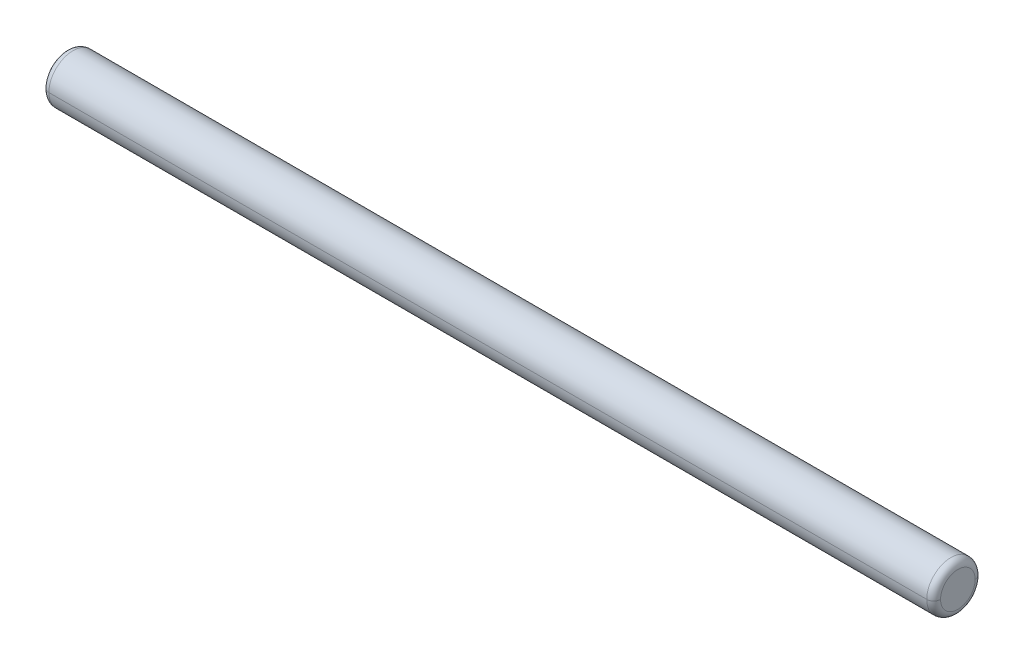
ISO-10303-21;
HEADER;
FILE_DESCRIPTION(('STEP AP214'),'2;1');
FILE_NAME('part.step','',(''),(''),'','','');
FILE_SCHEMA(('AUTOMOTIVE_DESIGN { 1 0 10303 214 1 1 1 1 }'));
ENDSEC;
DATA;
#1=APPLICATION_CONTEXT('core data for automotive mechanical design processes');
#2=APPLICATION_PROTOCOL_DEFINITION('international standard','automotive_design',2000,#1);
#3=PRODUCT_CONTEXT('',#1,'mechanical');
#4=PRODUCT('Part','Part','',(#3));
#5=PRODUCT_RELATED_PRODUCT_CATEGORY('part','',(#4));
#6=PRODUCT_DEFINITION_FORMATION('','',#4);
#7=PRODUCT_DEFINITION_CONTEXT('part definition',#1,'design');
#8=PRODUCT_DEFINITION('design','',#6,#7);
#9=PRODUCT_DEFINITION_SHAPE('','',#8);
#10=(LENGTH_UNIT() NAMED_UNIT(*) SI_UNIT(.MILLI.,.METRE.));
#11=(NAMED_UNIT(*) PLANE_ANGLE_UNIT() SI_UNIT($,.RADIAN.));
#12=(NAMED_UNIT(*) SI_UNIT($,.STERADIAN.) SOLID_ANGLE_UNIT());
#13=UNCERTAINTY_MEASURE_WITH_UNIT(LENGTH_MEASURE(1.E-05),#10,'distance_accuracy_value','');
#14=(GEOMETRIC_REPRESENTATION_CONTEXT(3) GLOBAL_UNCERTAINTY_ASSIGNED_CONTEXT((#13)) GLOBAL_UNIT_ASSIGNED_CONTEXT((#10,
#11,#12)) REPRESENTATION_CONTEXT('',''));
#15=CARTESIAN_POINT('',(0.,0.,0.));
#16=DIRECTION('',(0.,0.,1.));
#17=DIRECTION('',(1.,0.,0.));
#18=AXIS2_PLACEMENT_3D('',#15,#16,#17);
#19=CARTESIAN_POINT('',(1.,0.,0.));
#20=DIRECTION('',(1.,0.,0.));
#21=DIRECTION('',(0.,0.,-1.));
#22=AXIS2_PLACEMENT_3D('',#19,#20,#21);
#23=TOROIDAL_SURFACE('',#22,2.5,1.);
#24=CARTESIAN_POINT('',(1.,0.,2.5));
#25=DIRECTION('',(0.,1.,0.));
#26=DIRECTION('',(0.,0.,1.));
#27=AXIS2_PLACEMENT_3D('',#24,#25,#26);
#28=CIRCLE('',#27,1.);
#29=CARTESIAN_POINT('',(0.,0.,2.5));
#30=VERTEX_POINT('',#29);
#31=CARTESIAN_POINT('',(1.,0.,3.5));
#32=VERTEX_POINT('',#31);
#33=EDGE_CURVE('E83',#30,#32,#28,.T.);
#34=ORIENTED_EDGE('',*,*,#33,.F.);
#35=CARTESIAN_POINT('',(0.,0.,0.));
#36=DIRECTION('',(-1.,0.,0.));
#37=DIRECTION('',(0.,0.,-1.));
#38=AXIS2_PLACEMENT_3D('',#35,#36,#37);
#39=CIRCLE('',#38,2.5);
#40=CARTESIAN_POINT('',(0.,0.,-2.5));
#41=VERTEX_POINT('',#40);
#42=EDGE_CURVE('E9',#41,#30,#39,.T.);
#43=ORIENTED_EDGE('',*,*,#42,.F.);
#44=CARTESIAN_POINT('',(1.,0.,-2.5));
#45=DIRECTION('',(0.,-1.,0.));
#46=DIRECTION('',(0.,0.,-1.));
#47=AXIS2_PLACEMENT_3D('',#44,#45,#46);
#48=CIRCLE('',#47,1.);
#49=CARTESIAN_POINT('',(1.,0.,-3.5));
#50=VERTEX_POINT('',#49);
#51=EDGE_CURVE('E90',#41,#50,#48,.T.);
#52=ORIENTED_EDGE('',*,*,#51,.T.);
#53=CARTESIAN_POINT('',(1.,0.,0.));
#54=DIRECTION('',(1.,0.,0.));
#55=DIRECTION('',(0.,0.,-1.));
#56=AXIS2_PLACEMENT_3D('',#53,#54,#55);
#57=CIRCLE('',#56,3.5);
#58=EDGE_CURVE('E59',#32,#50,#57,.T.);
#59=ORIENTED_EDGE('',*,*,#58,.F.);
#60=EDGE_LOOP('',(#34,#43,#52,#59));
#61=FACE_BOUND('',#60,.T.);
#62=ADVANCED_FACE('F14',(#61),#23,.T.);
#63=CARTESIAN_POINT('',(127.955038490697,0.,0.));
#64=DIRECTION('',(1.,0.,0.));
#65=DIRECTION('',(0.,0.,-1.));
#66=AXIS2_PLACEMENT_3D('',#63,#64,#65);
#67=TOROIDAL_SURFACE('',#66,2.5,1.);
#68=CARTESIAN_POINT('',(127.955038490697,0.,2.5));
#69=DIRECTION('',(0.,1.,0.));
#70=DIRECTION('',(0.,0.,1.));
#71=AXIS2_PLACEMENT_3D('',#68,#69,#70);
#72=CIRCLE('',#71,1.);
#73=CARTESIAN_POINT('',(127.955038490697,0.,3.5));
#74=VERTEX_POINT('',#73);
#75=CARTESIAN_POINT('',(128.955038490697,0.,2.5));
#76=VERTEX_POINT('',#75);
#77=EDGE_CURVE('E100',#74,#76,#72,.T.);
#78=ORIENTED_EDGE('',*,*,#77,.F.);
#79=CARTESIAN_POINT('',(127.955038490697,0.,0.));
#80=DIRECTION('',(-1.,0.,0.));
#81=DIRECTION('',(0.,0.,-1.));
#82=AXIS2_PLACEMENT_3D('',#79,#80,#81);
#83=CIRCLE('',#82,3.5);
#84=CARTESIAN_POINT('',(127.955038490697,0.,-3.5));
#85=VERTEX_POINT('',#84);
#86=EDGE_CURVE('E125',#85,#74,#83,.T.);
#87=ORIENTED_EDGE('',*,*,#86,.F.);
#88=CARTESIAN_POINT('',(127.955038490697,0.,-2.5));
#89=DIRECTION('',(0.,-1.,0.));
#90=DIRECTION('',(0.,0.,-1.));
#91=AXIS2_PLACEMENT_3D('',#88,#89,#90);
#92=CIRCLE('',#91,1.);
#93=CARTESIAN_POINT('',(128.955038490697,0.,-2.5));
#94=VERTEX_POINT('',#93);
#95=EDGE_CURVE('E119',#85,#94,#92,.T.);
#96=ORIENTED_EDGE('',*,*,#95,.T.);
#97=CARTESIAN_POINT('',(128.955038490697,0.,0.));
#98=DIRECTION('',(1.,0.,0.));
#99=DIRECTION('',(0.,0.,-1.));
#100=AXIS2_PLACEMENT_3D('',#97,#98,#99);
#101=CIRCLE('',#100,2.5);
#102=EDGE_CURVE('E25',#76,#94,#101,.T.);
#103=ORIENTED_EDGE('',*,*,#102,.F.);
#104=EDGE_LOOP('',(#78,#87,#96,#103));
#105=FACE_BOUND('',#104,.T.);
#106=ADVANCED_FACE('F145',(#105),#67,.T.);
#107=CARTESIAN_POINT('',(0.,0.,0.));
#108=DIRECTION('',(1.,0.,0.));
#109=DIRECTION('',(0.,1.,0.));
#110=AXIS2_PLACEMENT_3D('',#107,#108,#109);
#111=PLANE('',#110);
#112=ORIENTED_EDGE('',*,*,#42,.T.);
#113=CARTESIAN_POINT('',(0.,0.,0.));
#114=DIRECTION('',(-1.,0.,0.));
#115=DIRECTION('',(0.,0.,-1.));
#116=AXIS2_PLACEMENT_3D('',#113,#114,#115);
#117=CIRCLE('',#116,2.5);
#118=EDGE_CURVE('E81',#30,#41,#117,.T.);
#119=ORIENTED_EDGE('',*,*,#118,.T.);
#120=EDGE_LOOP('',(#112,#119));
#121=FACE_BOUND('',#120,.T.);
#122=ADVANCED_FACE('F79',(#121),#111,.F.);
#123=CARTESIAN_POINT('',(128.955038490697,0.,0.));
#124=DIRECTION('',(1.,0.,0.));
#125=DIRECTION('',(0.,1.,0.));
#126=AXIS2_PLACEMENT_3D('',#123,#124,#125);
#127=PLANE('',#126);
#128=CARTESIAN_POINT('',(128.955038490697,0.,0.));
#129=DIRECTION('',(1.,0.,0.));
#130=DIRECTION('',(0.,0.,-1.));
#131=AXIS2_PLACEMENT_3D('',#128,#129,#130);
#132=CIRCLE('',#131,2.5);
#133=EDGE_CURVE('E109',#94,#76,#132,.T.);
#134=ORIENTED_EDGE('',*,*,#133,.T.);
#135=ORIENTED_EDGE('',*,*,#102,.T.);
#136=EDGE_LOOP('',(#134,#135));
#137=FACE_BOUND('',#136,.T.);
#138=ADVANCED_FACE('F146',(#137),#127,.T.);
#139=CARTESIAN_POINT('',(128.955038490697,0.,0.));
#140=DIRECTION('',(-1.,0.,0.));
#141=DIRECTION('',(0.,0.,1.));
#142=AXIS2_PLACEMENT_3D('',#139,#140,#141);
#143=CYLINDRICAL_SURFACE('',#142,3.5);
#144=DIRECTION('',(-1.,0.,0.));
#145=VECTOR('',#144,1.);
#146=CARTESIAN_POINT('',(128.955038490697,0.,-3.5));
#147=LINE('',#146,#145);
#148=EDGE_CURVE('E122',#85,#50,#147,.T.);
#149=ORIENTED_EDGE('',*,*,#148,.F.);
#150=ORIENTED_EDGE('',*,*,#86,.T.);
#151=DIRECTION('',(-1.,0.,0.));
#152=VECTOR('',#151,1.);
#153=CARTESIAN_POINT('',(128.955038490697,0.,3.5));
#154=LINE('',#153,#152);
#155=EDGE_CURVE('E18',#74,#32,#154,.T.);
#156=ORIENTED_EDGE('',*,*,#155,.T.);
#157=ORIENTED_EDGE('',*,*,#58,.T.);
#158=EDGE_LOOP('',(#149,#150,#156,#157));
#159=FACE_BOUND('',#158,.T.);
#160=ADVANCED_FACE('F139',(#159),#143,.T.);
#161=CARTESIAN_POINT('',(128.955038490697,0.,0.));
#162=DIRECTION('',(-1.,0.,0.));
#163=DIRECTION('',(0.,0.,1.));
#164=AXIS2_PLACEMENT_3D('',#161,#162,#163);
#165=CYLINDRICAL_SURFACE('',#164,3.5);
#166=CARTESIAN_POINT('',(127.955038490697,0.,0.));
#167=DIRECTION('',(-1.,0.,0.));
#168=DIRECTION('',(0.,0.,-1.));
#169=AXIS2_PLACEMENT_3D('',#166,#167,#168);
#170=CIRCLE('',#169,3.5);
#171=EDGE_CURVE('E97',#74,#85,#170,.T.);
#172=ORIENTED_EDGE('',*,*,#171,.T.);
#173=ORIENTED_EDGE('',*,*,#148,.T.);
#174=CARTESIAN_POINT('',(1.,0.,0.));
#175=DIRECTION('',(1.,0.,0.));
#176=DIRECTION('',(0.,0.,-1.));
#177=AXIS2_PLACEMENT_3D('',#174,#175,#176);
#178=CIRCLE('',#177,3.5);
#179=EDGE_CURVE('E87',#50,#32,#178,.T.);
#180=ORIENTED_EDGE('',*,*,#179,.T.);
#181=ORIENTED_EDGE('',*,*,#155,.F.);
#182=EDGE_LOOP('',(#172,#173,#180,#181));
#183=FACE_BOUND('',#182,.T.);
#184=ADVANCED_FACE('F16',(#183),#165,.T.);
#185=CARTESIAN_POINT('',(127.955038490697,0.,0.));
#186=DIRECTION('',(1.,0.,0.));
#187=DIRECTION('',(0.,0.,-1.));
#188=AXIS2_PLACEMENT_3D('',#185,#186,#187);
#189=TOROIDAL_SURFACE('',#188,2.5,1.);
#190=ORIENTED_EDGE('',*,*,#171,.F.);
#191=ORIENTED_EDGE('',*,*,#77,.T.);
#192=ORIENTED_EDGE('',*,*,#133,.F.);
#193=ORIENTED_EDGE('',*,*,#95,.F.);
#194=EDGE_LOOP('',(#190,#191,#192,#193));
#195=FACE_BOUND('',#194,.T.);
#196=ADVANCED_FACE('F142',(#195),#189,.T.);
#197=CARTESIAN_POINT('',(1.,0.,0.));
#198=DIRECTION('',(1.,0.,0.));
#199=DIRECTION('',(0.,0.,-1.));
#200=AXIS2_PLACEMENT_3D('',#197,#198,#199);
#201=TOROIDAL_SURFACE('',#200,2.5,1.);
#202=ORIENTED_EDGE('',*,*,#118,.F.);
#203=ORIENTED_EDGE('',*,*,#33,.T.);
#204=ORIENTED_EDGE('',*,*,#179,.F.);
#205=ORIENTED_EDGE('',*,*,#51,.F.);
#206=EDGE_LOOP('',(#202,#203,#204,#205));
#207=FACE_BOUND('',#206,.T.);
#208=ADVANCED_FACE('F89',(#207),#201,.T.);
#209=CLOSED_SHELL('',(#62,#106,#122,#138,#160,#184,#196,#208));
#210=MANIFOLD_SOLID_BREP('B1',#209);
#211=ADVANCED_BREP_SHAPE_REPRESENTATION('',(#18,#210),#14);
#212=SHAPE_DEFINITION_REPRESENTATION(#9,#211);
ENDSEC;
END-ISO-10303-21;
